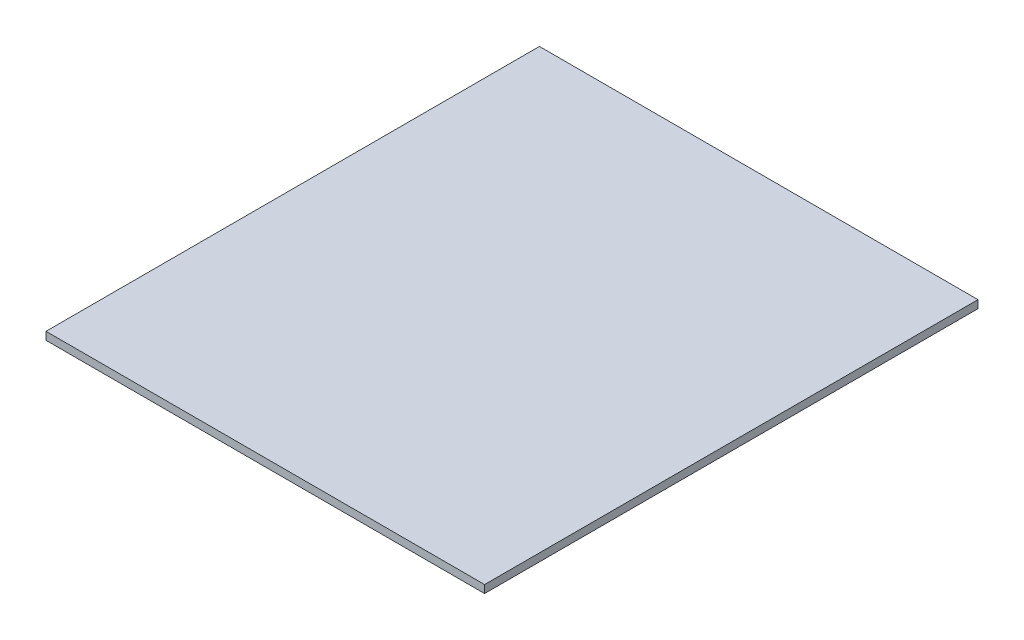
ISO-10303-21;
HEADER;
FILE_DESCRIPTION(('STEP AP214'),'2;1');
FILE_NAME('part.step','',(''),(''),'','','');
FILE_SCHEMA(('AUTOMOTIVE_DESIGN { 1 0 10303 214 1 1 1 1 }'));
ENDSEC;
DATA;
#1=APPLICATION_CONTEXT('core data for automotive mechanical design processes');
#2=APPLICATION_PROTOCOL_DEFINITION('international standard','automotive_design',2000,#1);
#3=PRODUCT_CONTEXT('',#1,'mechanical');
#4=PRODUCT('Part','Part','',(#3));
#5=PRODUCT_RELATED_PRODUCT_CATEGORY('part','',(#4));
#6=PRODUCT_DEFINITION_FORMATION('','',#4);
#7=PRODUCT_DEFINITION_CONTEXT('part definition',#1,'design');
#8=PRODUCT_DEFINITION('design','',#6,#7);
#9=PRODUCT_DEFINITION_SHAPE('','',#8);
#10=(LENGTH_UNIT() NAMED_UNIT(*) SI_UNIT(.MILLI.,.METRE.));
#11=(NAMED_UNIT(*) PLANE_ANGLE_UNIT() SI_UNIT($,.RADIAN.));
#12=(NAMED_UNIT(*) SI_UNIT($,.STERADIAN.) SOLID_ANGLE_UNIT());
#13=UNCERTAINTY_MEASURE_WITH_UNIT(LENGTH_MEASURE(1.E-05),#10,'distance_accuracy_value','');
#14=(GEOMETRIC_REPRESENTATION_CONTEXT(3) GLOBAL_UNCERTAINTY_ASSIGNED_CONTEXT((#13)) GLOBAL_UNIT_ASSIGNED_CONTEXT((#10,
#11,#12)) REPRESENTATION_CONTEXT('',''));
#15=CARTESIAN_POINT('',(0.,0.,0.));
#16=DIRECTION('',(0.,0.,1.));
#17=DIRECTION('',(1.,0.,0.));
#18=AXIS2_PLACEMENT_3D('',#15,#16,#17);
#19=CARTESIAN_POINT('',(0.,6.35,0.));
#20=DIRECTION('',(1.,0.,0.));
#21=DIRECTION('',(0.,0.,-1.));
#22=AXIS2_PLACEMENT_3D('',#19,#20,#21);
#23=PLANE('',#22);
#24=DIRECTION('',(0.,0.,1.));
#25=VECTOR('',#24,1.);
#26=CARTESIAN_POINT('',(0.,0.,0.));
#27=LINE('',#26,#25);
#28=CARTESIAN_POINT('',(0.,0.,-400.05));
#29=VERTEX_POINT('',#28);
#30=CARTESIAN_POINT('',(0.,0.,0.));
#31=VERTEX_POINT('',#30);
#32=EDGE_CURVE('E100',#29,#31,#27,.T.);
#33=ORIENTED_EDGE('',*,*,#32,.T.);
#34=DIRECTION('',(0.,-1.,0.));
#35=VECTOR('',#34,1.);
#36=CARTESIAN_POINT('',(0.,6.35,0.));
#37=LINE('',#36,#35);
#38=CARTESIAN_POINT('',(0.,6.35,0.));
#39=VERTEX_POINT('',#38);
#40=EDGE_CURVE('E11',#39,#31,#37,.T.);
#41=ORIENTED_EDGE('',*,*,#40,.F.);
#42=DIRECTION('',(0.,0.,1.));
#43=VECTOR('',#42,1.);
#44=CARTESIAN_POINT('',(0.,6.35,0.));
#45=LINE('',#44,#43);
#46=CARTESIAN_POINT('',(0.,6.35,-400.05));
#47=VERTEX_POINT('',#46);
#48=EDGE_CURVE('E88',#47,#39,#45,.T.);
#49=ORIENTED_EDGE('',*,*,#48,.F.);
#50=DIRECTION('',(0.,-1.,0.));
#51=VECTOR('',#50,1.);
#52=CARTESIAN_POINT('',(0.,6.35,-400.05));
#53=LINE('',#52,#51);
#54=EDGE_CURVE('E96',#47,#29,#53,.T.);
#55=ORIENTED_EDGE('',*,*,#54,.T.);
#56=EDGE_LOOP('',(#33,#41,#49,#55));
#57=FACE_BOUND('',#56,.T.);
#58=ADVANCED_FACE('F37',(#57),#23,.F.);
#59=CARTESIAN_POINT('',(0.,6.35,0.));
#60=DIRECTION('',(0.,0.,-1.));
#61=DIRECTION('',(-1.,0.,0.));
#62=AXIS2_PLACEMENT_3D('',#59,#60,#61);
#63=PLANE('',#62);
#64=DIRECTION('',(1.,0.,0.));
#65=VECTOR('',#64,1.);
#66=CARTESIAN_POINT('',(0.,0.,0.));
#67=LINE('',#66,#65);
#68=CARTESIAN_POINT('',(355.6,0.,0.));
#69=VERTEX_POINT('',#68);
#70=EDGE_CURVE('E92',#31,#69,#67,.T.);
#71=ORIENTED_EDGE('',*,*,#70,.T.);
#72=DIRECTION('',(0.,-1.,0.));
#73=VECTOR('',#72,1.);
#74=CARTESIAN_POINT('',(355.6,6.35,0.));
#75=LINE('',#74,#73);
#76=CARTESIAN_POINT('',(355.6,6.35,0.));
#77=VERTEX_POINT('',#76);
#78=EDGE_CURVE('E45',#77,#69,#75,.T.);
#79=ORIENTED_EDGE('',*,*,#78,.F.);
#80=DIRECTION('',(1.,0.,0.));
#81=VECTOR('',#80,1.);
#82=CARTESIAN_POINT('',(0.,6.35,0.));
#83=LINE('',#82,#81);
#84=EDGE_CURVE('E83',#39,#77,#83,.T.);
#85=ORIENTED_EDGE('',*,*,#84,.F.);
#86=ORIENTED_EDGE('',*,*,#40,.T.);
#87=EDGE_LOOP('',(#71,#79,#85,#86));
#88=FACE_BOUND('',#87,.T.);
#89=ADVANCED_FACE('F91',(#88),#63,.F.);
#90=CARTESIAN_POINT('',(355.6,6.35,0.));
#91=DIRECTION('',(-1.,0.,0.));
#92=DIRECTION('',(0.,0.,1.));
#93=AXIS2_PLACEMENT_3D('',#90,#91,#92);
#94=PLANE('',#93);
#95=DIRECTION('',(0.,0.,-1.));
#96=VECTOR('',#95,1.);
#97=CARTESIAN_POINT('',(355.6,0.,0.));
#98=LINE('',#97,#96);
#99=CARTESIAN_POINT('',(355.6,0.,-400.05));
#100=VERTEX_POINT('',#99);
#101=EDGE_CURVE('E70',#69,#100,#98,.T.);
#102=ORIENTED_EDGE('',*,*,#101,.T.);
#103=DIRECTION('',(0.,-1.,0.));
#104=VECTOR('',#103,1.);
#105=CARTESIAN_POINT('',(355.6,6.35,-400.05));
#106=LINE('',#105,#104);
#107=CARTESIAN_POINT('',(355.6,6.35,-400.05));
#108=VERTEX_POINT('',#107);
#109=EDGE_CURVE('E93',#108,#100,#106,.T.);
#110=ORIENTED_EDGE('',*,*,#109,.F.);
#111=DIRECTION('',(0.,0.,-1.));
#112=VECTOR('',#111,1.);
#113=CARTESIAN_POINT('',(355.6,6.35,0.));
#114=LINE('',#113,#112);
#115=EDGE_CURVE('E86',#77,#108,#114,.T.);
#116=ORIENTED_EDGE('',*,*,#115,.F.);
#117=ORIENTED_EDGE('',*,*,#78,.T.);
#118=EDGE_LOOP('',(#102,#110,#116,#117));
#119=FACE_BOUND('',#118,.T.);
#120=ADVANCED_FACE('F94',(#119),#94,.F.);
#121=CARTESIAN_POINT('',(0.,6.35,-400.05));
#122=DIRECTION('',(0.,0.,1.));
#123=DIRECTION('',(1.,0.,0.));
#124=AXIS2_PLACEMENT_3D('',#121,#122,#123);
#125=PLANE('',#124);
#126=DIRECTION('',(-1.,0.,0.));
#127=VECTOR('',#126,1.);
#128=CARTESIAN_POINT('',(0.,0.,-400.05));
#129=LINE('',#128,#127);
#130=EDGE_CURVE('E76',#100,#29,#129,.T.);
#131=ORIENTED_EDGE('',*,*,#130,.T.);
#132=ORIENTED_EDGE('',*,*,#54,.F.);
#133=DIRECTION('',(-1.,0.,0.));
#134=VECTOR('',#133,1.);
#135=CARTESIAN_POINT('',(0.,6.35,-400.05));
#136=LINE('',#135,#134);
#137=EDGE_CURVE('E53',#108,#47,#136,.T.);
#138=ORIENTED_EDGE('',*,*,#137,.F.);
#139=ORIENTED_EDGE('',*,*,#109,.T.);
#140=EDGE_LOOP('',(#131,#132,#138,#139));
#141=FACE_BOUND('',#140,.T.);
#142=ADVANCED_FACE('F107',(#141),#125,.F.);
#143=CARTESIAN_POINT('',(0.,6.35,0.));
#144=DIRECTION('',(0.,-1.,0.));
#145=DIRECTION('',(0.,0.,-1.));
#146=AXIS2_PLACEMENT_3D('',#143,#144,#145);
#147=PLANE('',#146);
#148=ORIENTED_EDGE('',*,*,#48,.T.);
#149=ORIENTED_EDGE('',*,*,#84,.T.);
#150=ORIENTED_EDGE('',*,*,#115,.T.);
#151=ORIENTED_EDGE('',*,*,#137,.T.);
#152=EDGE_LOOP('',(#148,#149,#150,#151));
#153=FACE_BOUND('',#152,.T.);
#154=ADVANCED_FACE('F84',(#153),#147,.F.);
#155=CARTESIAN_POINT('',(0.,0.,0.));
#156=DIRECTION('',(0.,-1.,0.));
#157=DIRECTION('',(0.,0.,-1.));
#158=AXIS2_PLACEMENT_3D('',#155,#156,#157);
#159=PLANE('',#158);
#160=ORIENTED_EDGE('',*,*,#32,.F.);
#161=ORIENTED_EDGE('',*,*,#130,.F.);
#162=ORIENTED_EDGE('',*,*,#101,.F.);
#163=ORIENTED_EDGE('',*,*,#70,.F.);
#164=EDGE_LOOP('',(#160,#161,#162,#163));
#165=FACE_BOUND('',#164,.T.);
#166=ADVANCED_FACE('F110',(#165),#159,.T.);
#167=CLOSED_SHELL('',(#58,#89,#120,#142,#154,#166));
#168=MANIFOLD_SOLID_BREP('B2',#167);
#169=ADVANCED_BREP_SHAPE_REPRESENTATION('',(#18,#168),#14);
#170=SHAPE_DEFINITION_REPRESENTATION(#9,#169);
ENDSEC;
END-ISO-10303-21;
